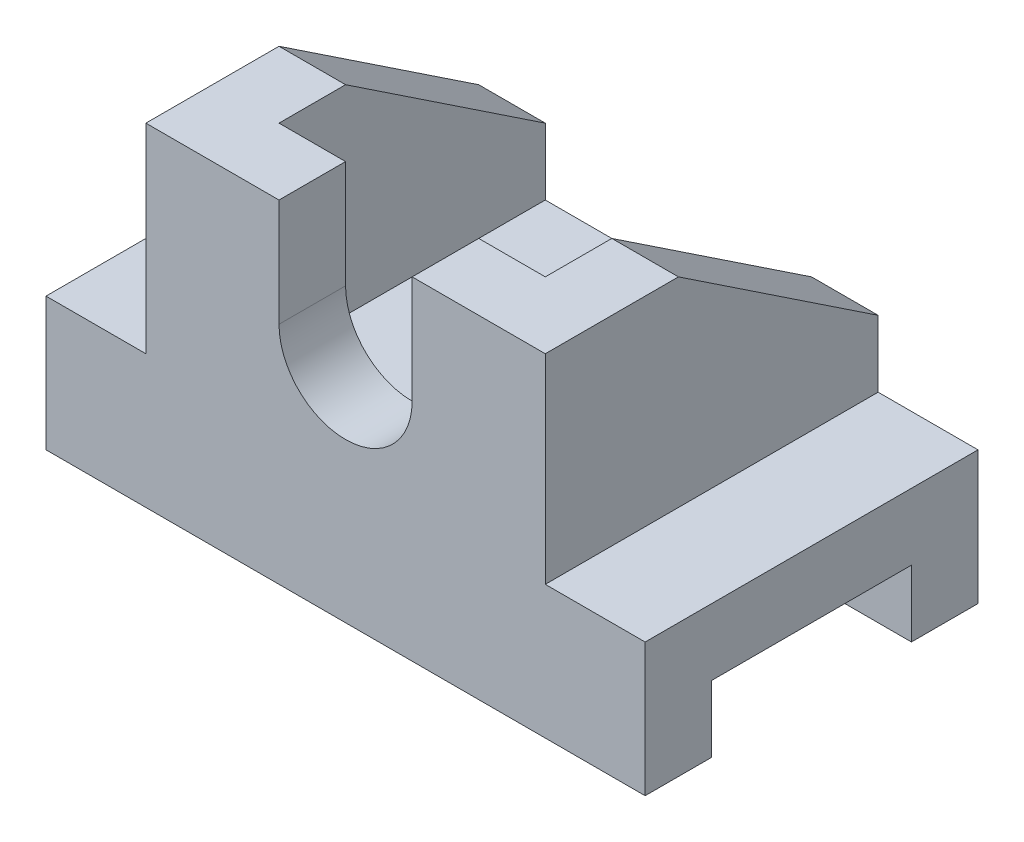
ISO-10303-21;
HEADER;
FILE_DESCRIPTION(('STEP AP214'),'2;1');
FILE_NAME('part.step','',(''),(''),'','','');
FILE_SCHEMA(('AUTOMOTIVE_DESIGN { 1 0 10303 214 1 1 1 1 }'));
ENDSEC;
DATA;
#1=APPLICATION_CONTEXT('core data for automotive mechanical design processes');
#2=APPLICATION_PROTOCOL_DEFINITION('international standard','automotive_design',2000,#1);
#3=PRODUCT_CONTEXT('',#1,'mechanical');
#4=PRODUCT('Part','Part','',(#3));
#5=PRODUCT_RELATED_PRODUCT_CATEGORY('part','',(#4));
#6=PRODUCT_DEFINITION_FORMATION('','',#4);
#7=PRODUCT_DEFINITION_CONTEXT('part definition',#1,'design');
#8=PRODUCT_DEFINITION('design','',#6,#7);
#9=PRODUCT_DEFINITION_SHAPE('','',#8);
#10=(LENGTH_UNIT() NAMED_UNIT(*) SI_UNIT(.MILLI.,.METRE.));
#11=(NAMED_UNIT(*) PLANE_ANGLE_UNIT() SI_UNIT($,.RADIAN.));
#12=(NAMED_UNIT(*) SI_UNIT($,.STERADIAN.) SOLID_ANGLE_UNIT());
#13=UNCERTAINTY_MEASURE_WITH_UNIT(LENGTH_MEASURE(1.E-05),#10,'distance_accuracy_value','');
#14=(GEOMETRIC_REPRESENTATION_CONTEXT(3) GLOBAL_UNCERTAINTY_ASSIGNED_CONTEXT((#13)) GLOBAL_UNIT_ASSIGNED_CONTEXT((#10,
#11,#12)) REPRESENTATION_CONTEXT('',''));
#15=CARTESIAN_POINT('',(0.,0.,0.));
#16=DIRECTION('',(0.,0.,1.));
#17=DIRECTION('',(1.,0.,0.));
#18=AXIS2_PLACEMENT_3D('',#15,#16,#17);
#19=CARTESIAN_POINT('',(45.,10.,-25.3409090909091));
#20=DIRECTION('',(0.,-1.,0.));
#21=DIRECTION('',(0.,0.,-1.));
#22=AXIS2_PLACEMENT_3D('',#19,#20,#21);
#23=PLANE('',#22);
#24=CARTESIAN_POINT('',(0.,10.,-5.34090909090908));
#25=DIRECTION('',(0.,1.,0.));
#26=DIRECTION('',(0.,0.,1.));
#27=AXIS2_PLACEMENT_3D('',#24,#25,#26);
#28=CIRCLE('',#27,10.);
#29=CARTESIAN_POINT('',(0.,10.,4.65909090909092));
#30=VERTEX_POINT('',#29);
#31=EDGE_CURVE('E257',#30,#30,#28,.T.);
#32=ORIENTED_EDGE('',*,*,#31,.F.);
#33=EDGE_LOOP('',(#32));
#34=FACE_BOUND('',#33,.T.);
#35=DIRECTION('',(0.,0.,-1.));
#36=VECTOR('',#35,1.);
#37=CARTESIAN_POINT('',(-20.,10.,14.6590909090909));
#38=LINE('',#37,#36);
#39=CARTESIAN_POINT('',(-20.,10.,14.6590909090909));
#40=VERTEX_POINT('',#39);
#41=CARTESIAN_POINT('',(-20.,10.,-25.3409090909091));
#42=VERTEX_POINT('',#41);
#43=EDGE_CURVE('E204',#40,#42,#38,.T.);
#44=ORIENTED_EDGE('',*,*,#43,.F.);
#45=DIRECTION('',(1.,0.,0.));
#46=VECTOR('',#45,1.);
#47=CARTESIAN_POINT('',(30.,10.,14.6590909090909));
#48=LINE('',#47,#46);
#49=CARTESIAN_POINT('',(20.,10.,14.6590909090909));
#50=VERTEX_POINT('',#49);
#51=EDGE_CURVE('E290',#40,#50,#48,.T.);
#52=ORIENTED_EDGE('',*,*,#51,.T.);
#53=DIRECTION('',(0.,0.,-1.));
#54=VECTOR('',#53,1.);
#55=CARTESIAN_POINT('',(20.,10.,14.6590909090909));
#56=LINE('',#55,#54);
#57=CARTESIAN_POINT('',(20.,10.,-25.3409090909091));
#58=VERTEX_POINT('',#57);
#59=EDGE_CURVE('E242',#50,#58,#56,.T.);
#60=ORIENTED_EDGE('',*,*,#59,.T.);
#61=DIRECTION('',(-1.,0.,0.));
#62=VECTOR('',#61,1.);
#63=CARTESIAN_POINT('',(45.,10.,-25.3409090909091));
#64=LINE('',#63,#62);
#65=EDGE_CURVE('E394',#58,#42,#64,.T.);
#66=ORIENTED_EDGE('',*,*,#65,.T.);
#67=EDGE_LOOP('',(#44,#52,#60,#66));
#68=FACE_BOUND('',#67,.T.);
#69=ADVANCED_FACE('F38',(#34,#68),#23,.F.);
#70=CARTESIAN_POINT('',(0.,0.,14.6590909090909));
#71=DIRECTION('',(0.,0.,-1.));
#72=DIRECTION('',(-1.,0.,0.));
#73=AXIS2_PLACEMENT_3D('',#70,#71,#72);
#74=PLANE('',#73);
#75=ORIENTED_EDGE('',*,*,#51,.F.);
#76=DIRECTION('',(0.,-1.,0.));
#77=VECTOR('',#76,1.);
#78=CARTESIAN_POINT('',(-20.,10.,14.6590909090909));
#79=LINE('',#78,#77);
#80=CARTESIAN_POINT('',(-20.,40.,14.6590909090909));
#81=VERTEX_POINT('',#80);
#82=EDGE_CURVE('E221',#81,#40,#79,.T.);
#83=ORIENTED_EDGE('',*,*,#82,.F.);
#84=DIRECTION('',(-1.,0.,0.));
#85=VECTOR('',#84,1.);
#86=CARTESIAN_POINT('',(-30.,40.,14.6590909090909));
#87=LINE('',#86,#85);
#88=CARTESIAN_POINT('',(-10.,40.,14.6590909090909));
#89=VERTEX_POINT('',#88);
#90=EDGE_CURVE('E293',#89,#81,#87,.T.);
#91=ORIENTED_EDGE('',*,*,#90,.F.);
#92=DIRECTION('',(0.,1.,0.));
#93=VECTOR('',#92,1.);
#94=CARTESIAN_POINT('',(-10.,0.,14.6590909090909));
#95=LINE('',#94,#93);
#96=CARTESIAN_POINT('',(-10.,23.83424034646,14.6590909090909));
#97=VERTEX_POINT('',#96);
#98=EDGE_CURVE('E411',#97,#89,#95,.T.);
#99=ORIENTED_EDGE('',*,*,#98,.F.);
#100=CARTESIAN_POINT('',(0.,23.83424034646,14.6590909090909));
#101=DIRECTION('',(0.,0.,-1.));
#102=DIRECTION('',(-1.,0.,0.));
#103=AXIS2_PLACEMENT_3D('',#100,#101,#102);
#104=CIRCLE('',#103,10.);
#105=CARTESIAN_POINT('',(10.,23.83424034646,14.6590909090909));
#106=VERTEX_POINT('',#105);
#107=EDGE_CURVE('E47',#106,#97,#104,.T.);
#108=ORIENTED_EDGE('',*,*,#107,.F.);
#109=DIRECTION('',(0.,-1.,0.));
#110=VECTOR('',#109,1.);
#111=CARTESIAN_POINT('',(10.,0.,14.6590909090909));
#112=LINE('',#111,#110);
#113=CARTESIAN_POINT('',(10.,40.,14.6590909090909));
#114=VERTEX_POINT('',#113);
#115=EDGE_CURVE('E11',#114,#106,#112,.T.);
#116=ORIENTED_EDGE('',*,*,#115,.F.);
#117=CARTESIAN_POINT('',(20.,40.,14.6590909090909));
#118=VERTEX_POINT('',#117);
#119=EDGE_CURVE('E295',#118,#114,#87,.T.);
#120=ORIENTED_EDGE('',*,*,#119,.F.);
#121=DIRECTION('',(0.,-1.,0.));
#122=VECTOR('',#121,1.);
#123=CARTESIAN_POINT('',(20.,10.,14.6590909090909));
#124=LINE('',#123,#122);
#125=EDGE_CURVE('E238',#118,#50,#124,.T.);
#126=ORIENTED_EDGE('',*,*,#125,.T.);
#127=EDGE_LOOP('',(#75,#83,#91,#99,#108,#116,#120,#126));
#128=FACE_BOUND('',#127,.T.);
#129=ADVANCED_FACE('F424',(#128),#74,.T.);
#130=DIRECTION('',(0.,0.,1.));
#131=VECTOR('',#130,1.);
#132=CARTESIAN_POINT('',(-30.,10.,14.6590909090909));
#133=LINE('',#132,#131);
#134=CARTESIAN_POINT('',(-30.,10.,-25.3409090909091));
#135=VERTEX_POINT('',#134);
#136=CARTESIAN_POINT('',(-30.,10.,24.6590909090909));
#137=VERTEX_POINT('',#136);
#138=EDGE_CURVE('E310',#135,#137,#133,.T.);
#139=ORIENTED_EDGE('',*,*,#138,.F.);
#140=CARTESIAN_POINT('',(-45.,10.,-25.3409090909091));
#141=VERTEX_POINT('',#140);
#142=EDGE_CURVE('E388',#135,#141,#64,.T.);
#143=ORIENTED_EDGE('',*,*,#142,.T.);
#144=DIRECTION('',(0.,0.,1.));
#145=VECTOR('',#144,1.);
#146=CARTESIAN_POINT('',(-45.,10.,-25.3409090909091));
#147=LINE('',#146,#145);
#148=CARTESIAN_POINT('',(-45.,9.99999999999999,24.6590909090909));
#149=VERTEX_POINT('',#148);
#150=EDGE_CURVE('E367',#141,#149,#147,.T.);
#151=ORIENTED_EDGE('',*,*,#150,.T.);
#152=DIRECTION('',(-1.,0.,0.));
#153=VECTOR('',#152,1.);
#154=CARTESIAN_POINT('',(45.,9.99999999999999,24.6590909090909));
#155=LINE('',#154,#153);
#156=EDGE_CURVE('E383',#137,#149,#155,.T.);
#157=ORIENTED_EDGE('',*,*,#156,.F.);
#158=EDGE_LOOP('',(#139,#143,#151,#157));
#159=FACE_BOUND('',#158,.T.);
#160=ADVANCED_FACE('F481',(#159),#23,.F.);
#161=CARTESIAN_POINT('',(-30.,40.,14.6590909090909));
#162=DIRECTION('',(0.,1.,0.));
#163=DIRECTION('',(0.,0.,1.));
#164=AXIS2_PLACEMENT_3D('',#161,#162,#163);
#165=PLANE('',#164);
#166=DIRECTION('',(0.,0.,1.));
#167=VECTOR('',#166,1.);
#168=CARTESIAN_POINT('',(20.,40.,4.65909090909092));
#169=LINE('',#168,#167);
#170=CARTESIAN_POINT('',(20.,40.,4.65909090909092));
#171=VERTEX_POINT('',#170);
#172=EDGE_CURVE('E234',#171,#118,#169,.T.);
#173=ORIENTED_EDGE('',*,*,#172,.T.);
#174=ORIENTED_EDGE('',*,*,#119,.T.);
#175=DIRECTION('',(0.,0.,1.));
#176=VECTOR('',#175,1.);
#177=CARTESIAN_POINT('',(10.,40.,-25.3409090909091));
#178=LINE('',#177,#176);
#179=CARTESIAN_POINT('',(10.,40.,24.6590909090909));
#180=VERTEX_POINT('',#179);
#181=EDGE_CURVE('E276',#114,#180,#178,.T.);
#182=ORIENTED_EDGE('',*,*,#181,.T.);
#183=DIRECTION('',(-1.,0.,0.));
#184=VECTOR('',#183,1.);
#185=CARTESIAN_POINT('',(-30.,40.,24.6590909090909));
#186=LINE('',#185,#184);
#187=CARTESIAN_POINT('',(30.,40.,24.6590909090909));
#188=VERTEX_POINT('',#187);
#189=EDGE_CURVE('E303',#188,#180,#186,.T.);
#190=ORIENTED_EDGE('',*,*,#189,.F.);
#191=DIRECTION('',(0.,0.,1.));
#192=VECTOR('',#191,1.);
#193=CARTESIAN_POINT('',(30.,40.,14.6590909090909));
#194=LINE('',#193,#192);
#195=CARTESIAN_POINT('',(30.,40.,4.65909090909092));
#196=VERTEX_POINT('',#195);
#197=EDGE_CURVE('E318',#196,#188,#194,.T.);
#198=ORIENTED_EDGE('',*,*,#197,.F.);
#199=DIRECTION('',(1.,0.,0.));
#200=VECTOR('',#199,1.);
#201=CARTESIAN_POINT('',(20.,40.,4.65909090909092));
#202=LINE('',#201,#200);
#203=EDGE_CURVE('E253',#171,#196,#202,.T.);
#204=ORIENTED_EDGE('',*,*,#203,.F.);
#205=EDGE_LOOP('',(#173,#174,#182,#190,#198,#204));
#206=FACE_BOUND('',#205,.T.);
#207=ADVANCED_FACE('F499',(#206),#165,.T.);
#208=CARTESIAN_POINT('',(45.,10.,-25.3409090909091));
#209=VERTEX_POINT('',#208);
#210=CARTESIAN_POINT('',(30.,10.,-25.3409090909091));
#211=VERTEX_POINT('',#210);
#212=EDGE_CURVE('E389',#209,#211,#64,.T.);
#213=ORIENTED_EDGE('',*,*,#212,.T.);
#214=DIRECTION('',(0.,0.,1.));
#215=VECTOR('',#214,1.);
#216=CARTESIAN_POINT('',(30.,10.,14.6590909090909));
#217=LINE('',#216,#215);
#218=CARTESIAN_POINT('',(30.,9.99999999999999,24.6590909090909));
#219=VERTEX_POINT('',#218);
#220=EDGE_CURVE('E298',#211,#219,#217,.T.);
#221=ORIENTED_EDGE('',*,*,#220,.T.);
#222=CARTESIAN_POINT('',(45.,9.99999999999999,24.6590909090909));
#223=VERTEX_POINT('',#222);
#224=EDGE_CURVE('E384',#223,#219,#155,.T.);
#225=ORIENTED_EDGE('',*,*,#224,.F.);
#226=DIRECTION('',(0.,0.,1.));
#227=VECTOR('',#226,1.);
#228=CARTESIAN_POINT('',(45.,10.,-25.3409090909091));
#229=LINE('',#228,#227);
#230=EDGE_CURVE('E340',#209,#223,#229,.T.);
#231=ORIENTED_EDGE('',*,*,#230,.F.);
#232=EDGE_LOOP('',(#213,#221,#225,#231));
#233=FACE_BOUND('',#232,.T.);
#234=ADVANCED_FACE('F509',(#233),#23,.F.);
#235=CARTESIAN_POINT('',(45.,-10.,14.6590909090909));
#236=DIRECTION('',(0.,0.,1.));
#237=DIRECTION('',(1.,0.,0.));
#238=AXIS2_PLACEMENT_3D('',#235,#236,#237);
#239=PLANE('',#238);
#240=DIRECTION('',(0.,1.,0.));
#241=VECTOR('',#240,1.);
#242=CARTESIAN_POINT('',(-45.,-10.,14.6590909090909));
#243=LINE('',#242,#241);
#244=CARTESIAN_POINT('',(-45.,-10.,14.6590909090909));
#245=VERTEX_POINT('',#244);
#246=CARTESIAN_POINT('',(-45.,0.,14.6590909090909));
#247=VERTEX_POINT('',#246);
#248=EDGE_CURVE('E313',#245,#247,#243,.T.);
#249=ORIENTED_EDGE('',*,*,#248,.T.);
#250=DIRECTION('',(-1.,0.,0.));
#251=VECTOR('',#250,1.);
#252=CARTESIAN_POINT('',(45.,0.,14.6590909090909));
#253=LINE('',#252,#251);
#254=CARTESIAN_POINT('',(45.,0.,14.6590909090909));
#255=VERTEX_POINT('',#254);
#256=EDGE_CURVE('E407',#255,#247,#253,.T.);
#257=ORIENTED_EDGE('',*,*,#256,.F.);
#258=DIRECTION('',(0.,1.,0.));
#259=VECTOR('',#258,1.);
#260=CARTESIAN_POINT('',(45.,-10.,14.6590909090909));
#261=LINE('',#260,#259);
#262=CARTESIAN_POINT('',(45.,-10.,14.6590909090909));
#263=VERTEX_POINT('',#262);
#264=EDGE_CURVE('E323',#263,#255,#261,.T.);
#265=ORIENTED_EDGE('',*,*,#264,.F.);
#266=DIRECTION('',(-1.,0.,0.));
#267=VECTOR('',#266,1.);
#268=CARTESIAN_POINT('',(45.,-10.,14.6590909090909));
#269=LINE('',#268,#267);
#270=EDGE_CURVE('E349',#263,#245,#269,.T.);
#271=ORIENTED_EDGE('',*,*,#270,.T.);
#272=EDGE_LOOP('',(#249,#257,#265,#271));
#273=FACE_BOUND('',#272,.T.);
#274=ADVANCED_FACE('F40',(#273),#239,.F.);
#275=CARTESIAN_POINT('',(45.,0.,14.6590909090909));
#276=DIRECTION('',(0.,1.,0.));
#277=DIRECTION('',(0.,0.,1.));
#278=AXIS2_PLACEMENT_3D('',#275,#276,#277);
#279=PLANE('',#278);
#280=DIRECTION('',(-1.,0.,0.));
#281=VECTOR('',#280,1.);
#282=CARTESIAN_POINT('',(45.,0.,-15.3409090909091));
#283=LINE('',#282,#281);
#284=CARTESIAN_POINT('',(0.,0.,-15.3409090909091));
#285=VERTEX_POINT('',#284);
#286=CARTESIAN_POINT('',(-45.,0.,-15.3409090909091));
#287=VERTEX_POINT('',#286);
#288=EDGE_CURVE('E402',#285,#287,#283,.T.);
#289=ORIENTED_EDGE('',*,*,#288,.F.);
#290=CARTESIAN_POINT('',(0.,0.,-5.34090909090908));
#291=DIRECTION('',(0.,1.,0.));
#292=DIRECTION('',(0.,0.,1.));
#293=AXIS2_PLACEMENT_3D('',#290,#291,#292);
#294=CIRCLE('',#293,10.);
#295=EDGE_CURVE('E60',#285,#285,#294,.T.);
#296=ORIENTED_EDGE('',*,*,#295,.T.);
#297=CARTESIAN_POINT('',(45.,0.,-15.3409090909091));
#298=VERTEX_POINT('',#297);
#299=EDGE_CURVE('E403',#298,#285,#283,.T.);
#300=ORIENTED_EDGE('',*,*,#299,.F.);
#301=DIRECTION('',(0.,0.,-1.));
#302=VECTOR('',#301,1.);
#303=CARTESIAN_POINT('',(45.,0.,14.6590909090909));
#304=LINE('',#303,#302);
#305=EDGE_CURVE('E327',#255,#298,#304,.T.);
#306=ORIENTED_EDGE('',*,*,#305,.F.);
#307=ORIENTED_EDGE('',*,*,#256,.T.);
#308=DIRECTION('',(0.,0.,-1.));
#309=VECTOR('',#308,1.);
#310=CARTESIAN_POINT('',(-45.,0.,14.6590909090909));
#311=LINE('',#310,#309);
#312=EDGE_CURVE('E353',#247,#287,#311,.T.);
#313=ORIENTED_EDGE('',*,*,#312,.T.);
#314=EDGE_LOOP('',(#289,#296,#300,#306,#307,#313));
#315=FACE_BOUND('',#314,.T.);
#316=ADVANCED_FACE('F449',(#315),#279,.F.);
#317=CARTESIAN_POINT('',(45.,0.,-15.3409090909091));
#318=DIRECTION('',(0.,0.,-1.));
#319=DIRECTION('',(0.,1.,0.));
#320=AXIS2_PLACEMENT_3D('',#317,#318,#319);
#321=PLANE('',#320);
#322=DIRECTION('',(0.,-1.,0.));
#323=VECTOR('',#322,1.);
#324=CARTESIAN_POINT('',(-45.,0.,-15.3409090909091));
#325=LINE('',#324,#323);
#326=CARTESIAN_POINT('',(-45.,-10.,-15.3409090909091));
#327=VERTEX_POINT('',#326);
#328=EDGE_CURVE('E357',#287,#327,#325,.T.);
#329=ORIENTED_EDGE('',*,*,#328,.T.);
#330=DIRECTION('',(-1.,0.,0.));
#331=VECTOR('',#330,1.);
#332=CARTESIAN_POINT('',(45.,-10.,-15.3409090909091));
#333=LINE('',#332,#331);
#334=CARTESIAN_POINT('',(45.,-10.,-15.3409090909091));
#335=VERTEX_POINT('',#334);
#336=EDGE_CURVE('E398',#335,#327,#333,.T.);
#337=ORIENTED_EDGE('',*,*,#336,.F.);
#338=DIRECTION('',(0.,-1.,0.));
#339=VECTOR('',#338,1.);
#340=CARTESIAN_POINT('',(45.,0.,-15.3409090909091));
#341=LINE('',#340,#339);
#342=EDGE_CURVE('E331',#298,#335,#341,.T.);
#343=ORIENTED_EDGE('',*,*,#342,.F.);
#344=ORIENTED_EDGE('',*,*,#299,.T.);
#345=ORIENTED_EDGE('',*,*,#288,.T.);
#346=EDGE_LOOP('',(#329,#337,#343,#344,#345));
#347=FACE_BOUND('',#346,.T.);
#348=ADVANCED_FACE('F443',(#347),#321,.F.);
#349=CARTESIAN_POINT('',(45.,-10.,-15.3409090909091));
#350=DIRECTION('',(0.,1.,0.));
#351=DIRECTION('',(0.,0.,1.));
#352=AXIS2_PLACEMENT_3D('',#349,#350,#351);
#353=PLANE('',#352);
#354=DIRECTION('',(0.,0.,-1.));
#355=VECTOR('',#354,1.);
#356=CARTESIAN_POINT('',(-45.,-10.,-15.3409090909091));
#357=LINE('',#356,#355);
#358=CARTESIAN_POINT('',(-45.,-10.,-25.3409090909091));
#359=VERTEX_POINT('',#358);
#360=EDGE_CURVE('E360',#327,#359,#357,.T.);
#361=ORIENTED_EDGE('',*,*,#360,.T.);
#362=DIRECTION('',(-1.,0.,0.));
#363=VECTOR('',#362,1.);
#364=CARTESIAN_POINT('',(45.,-10.,-25.3409090909091));
#365=LINE('',#364,#363);
#366=CARTESIAN_POINT('',(45.,-10.,-25.3409090909091));
#367=VERTEX_POINT('',#366);
#368=EDGE_CURVE('E393',#367,#359,#365,.T.);
#369=ORIENTED_EDGE('',*,*,#368,.F.);
#370=DIRECTION('',(0.,0.,-1.));
#371=VECTOR('',#370,1.);
#372=CARTESIAN_POINT('',(45.,-10.,-15.3409090909091));
#373=LINE('',#372,#371);
#374=EDGE_CURVE('E334',#335,#367,#373,.T.);
#375=ORIENTED_EDGE('',*,*,#374,.F.);
#376=ORIENTED_EDGE('',*,*,#336,.T.);
#377=EDGE_LOOP('',(#361,#369,#375,#376));
#378=FACE_BOUND('',#377,.T.);
#379=ADVANCED_FACE('F459',(#378),#353,.F.);
#380=CARTESIAN_POINT('',(45.,-10.,-25.3409090909091));
#381=DIRECTION('',(0.,0.,1.));
#382=DIRECTION('',(1.,0.,0.));
#383=AXIS2_PLACEMENT_3D('',#380,#381,#382);
#384=PLANE('',#383);
#385=ORIENTED_EDGE('',*,*,#65,.F.);
#386=DIRECTION('',(0.,1.,0.));
#387=VECTOR('',#386,1.);
#388=CARTESIAN_POINT('',(20.,10.,-25.3409090909091));
#389=LINE('',#388,#387);
#390=CARTESIAN_POINT('',(20.,20.,-25.3409090909091));
#391=VERTEX_POINT('',#390);
#392=EDGE_CURVE('E225',#58,#391,#389,.T.);
#393=ORIENTED_EDGE('',*,*,#392,.T.);
#394=DIRECTION('',(1.,0.,0.));
#395=VECTOR('',#394,1.);
#396=CARTESIAN_POINT('',(20.,20.,-25.3409090909091));
#397=LINE('',#396,#395);
#398=CARTESIAN_POINT('',(30.,20.,-25.3409090909091));
#399=VERTEX_POINT('',#398);
#400=EDGE_CURVE('E246',#391,#399,#397,.T.);
#401=ORIENTED_EDGE('',*,*,#400,.T.);
#402=DIRECTION('',(0.,1.,0.));
#403=VECTOR('',#402,1.);
#404=CARTESIAN_POINT('',(30.,10.,-25.3409090909091));
#405=LINE('',#404,#403);
#406=EDGE_CURVE('E219',#211,#399,#405,.T.);
#407=ORIENTED_EDGE('',*,*,#406,.F.);
#408=ORIENTED_EDGE('',*,*,#212,.F.);
#409=DIRECTION('',(0.,1.,0.));
#410=VECTOR('',#409,1.);
#411=CARTESIAN_POINT('',(45.,-10.,-25.3409090909091));
#412=LINE('',#411,#410);
#413=EDGE_CURVE('E337',#367,#209,#412,.T.);
#414=ORIENTED_EDGE('',*,*,#413,.F.);
#415=ORIENTED_EDGE('',*,*,#368,.T.);
#416=DIRECTION('',(0.,1.,0.));
#417=VECTOR('',#416,1.);
#418=CARTESIAN_POINT('',(-45.,-10.,-25.3409090909091));
#419=LINE('',#418,#417);
#420=EDGE_CURVE('E363',#359,#141,#419,.T.);
#421=ORIENTED_EDGE('',*,*,#420,.T.);
#422=ORIENTED_EDGE('',*,*,#142,.F.);
#423=DIRECTION('',(0.,1.,0.));
#424=VECTOR('',#423,1.);
#425=CARTESIAN_POINT('',(-30.,10.,-25.3409090909091));
#426=LINE('',#425,#424);
#427=CARTESIAN_POINT('',(-30.,20.,-25.3409090909091));
#428=VERTEX_POINT('',#427);
#429=EDGE_CURVE('E214',#135,#428,#426,.T.);
#430=ORIENTED_EDGE('',*,*,#429,.T.);
#431=DIRECTION('',(-1.,0.,0.));
#432=VECTOR('',#431,1.);
#433=CARTESIAN_POINT('',(-20.,20.,-25.3409090909091));
#434=LINE('',#433,#432);
#435=CARTESIAN_POINT('',(-20.,20.,-25.3409090909091));
#436=VERTEX_POINT('',#435);
#437=EDGE_CURVE('E194',#436,#428,#434,.T.);
#438=ORIENTED_EDGE('',*,*,#437,.F.);
#439=DIRECTION('',(0.,1.,0.));
#440=VECTOR('',#439,1.);
#441=CARTESIAN_POINT('',(-20.,10.,-25.3409090909091));
#442=LINE('',#441,#440);
#443=EDGE_CURVE('E199',#42,#436,#442,.T.);
#444=ORIENTED_EDGE('',*,*,#443,.F.);
#445=EDGE_LOOP('',(#385,#393,#401,#407,#408,#414,#415,#421,#422,#430,#438,#444));
#446=FACE_BOUND('',#445,.T.);
#447=ADVANCED_FACE('F211',(#446),#384,.F.);
#448=CARTESIAN_POINT('',(45.,9.99999999999999,24.6590909090909));
#449=DIRECTION('',(0.,0.,-1.));
#450=DIRECTION('',(-1.,0.,0.));
#451=AXIS2_PLACEMENT_3D('',#448,#449,#450);
#452=PLANE('',#451);
#453=ORIENTED_EDGE('',*,*,#189,.T.);
#454=DIRECTION('',(0.,1.,0.));
#455=VECTOR('',#454,1.);
#456=CARTESIAN_POINT('',(10.,40.,24.6590909090909));
#457=LINE('',#456,#455);
#458=CARTESIAN_POINT('',(10.,23.83424034646,24.6590909090909));
#459=VERTEX_POINT('',#458);
#460=EDGE_CURVE('E262',#459,#180,#457,.T.);
#461=ORIENTED_EDGE('',*,*,#460,.F.);
#462=CARTESIAN_POINT('',(0.,23.83424034646,24.6590909090909));
#463=DIRECTION('',(0.,0.,1.));
#464=DIRECTION('',(1.,0.,0.));
#465=AXIS2_PLACEMENT_3D('',#462,#463,#464);
#466=CIRCLE('',#465,10.);
#467=CARTESIAN_POINT('',(-10.,23.83424034646,24.6590909090909));
#468=VERTEX_POINT('',#467);
#469=EDGE_CURVE('E272',#468,#459,#466,.T.);
#470=ORIENTED_EDGE('',*,*,#469,.F.);
#471=DIRECTION('',(0.,-1.,0.));
#472=VECTOR('',#471,1.);
#473=CARTESIAN_POINT('',(-10.,23.83424034646,24.6590909090909));
#474=LINE('',#473,#472);
#475=CARTESIAN_POINT('',(-10.,40.,24.6590909090909));
#476=VERTEX_POINT('',#475);
#477=EDGE_CURVE('E268',#476,#468,#474,.T.);
#478=ORIENTED_EDGE('',*,*,#477,.F.);
#479=CARTESIAN_POINT('',(-30.,40.,24.6590909090909));
#480=VERTEX_POINT('',#479);
#481=EDGE_CURVE('E302',#476,#480,#186,.T.);
#482=ORIENTED_EDGE('',*,*,#481,.T.);
#483=DIRECTION('',(0.,-1.,0.));
#484=VECTOR('',#483,1.);
#485=CARTESIAN_POINT('',(-30.,10.,24.6590909090909));
#486=LINE('',#485,#484);
#487=EDGE_CURVE('E294',#480,#137,#486,.T.);
#488=ORIENTED_EDGE('',*,*,#487,.T.);
#489=ORIENTED_EDGE('',*,*,#156,.T.);
#490=DIRECTION('',(0.,-1.,0.));
#491=VECTOR('',#490,1.);
#492=CARTESIAN_POINT('',(-45.,9.99999999999999,24.6590909090909));
#493=LINE('',#492,#491);
#494=CARTESIAN_POINT('',(-45.,-10.,24.6590909090909));
#495=VERTEX_POINT('',#494);
#496=EDGE_CURVE('E371',#149,#495,#493,.T.);
#497=ORIENTED_EDGE('',*,*,#496,.T.);
#498=DIRECTION('',(-1.,0.,0.));
#499=VECTOR('',#498,1.);
#500=CARTESIAN_POINT('',(45.,-10.,24.6590909090909));
#501=LINE('',#500,#499);
#502=CARTESIAN_POINT('',(45.,-10.,24.6590909090909));
#503=VERTEX_POINT('',#502);
#504=EDGE_CURVE('E379',#503,#495,#501,.T.);
#505=ORIENTED_EDGE('',*,*,#504,.F.);
#506=DIRECTION('',(0.,-1.,0.));
#507=VECTOR('',#506,1.);
#508=CARTESIAN_POINT('',(45.,9.99999999999999,24.6590909090909));
#509=LINE('',#508,#507);
#510=EDGE_CURVE('E343',#223,#503,#509,.T.);
#511=ORIENTED_EDGE('',*,*,#510,.F.);
#512=ORIENTED_EDGE('',*,*,#224,.T.);
#513=DIRECTION('',(0.,1.,0.));
#514=VECTOR('',#513,1.);
#515=CARTESIAN_POINT('',(30.,40.,24.6590909090909));
#516=LINE('',#515,#514);
#517=EDGE_CURVE('E280',#219,#188,#516,.T.);
#518=ORIENTED_EDGE('',*,*,#517,.T.);
#519=EDGE_LOOP('',(#453,#461,#470,#478,#482,#488,#489,#497,#505,#511,#512,#518));
#520=FACE_BOUND('',#519,.T.);
#521=ADVANCED_FACE('F478',(#520),#452,.F.);
#522=CARTESIAN_POINT('',(45.,-10.,24.6590909090909));
#523=DIRECTION('',(0.,1.,0.));
#524=DIRECTION('',(0.,0.,1.));
#525=AXIS2_PLACEMENT_3D('',#522,#523,#524);
#526=PLANE('',#525);
#527=DIRECTION('',(0.,0.,-1.));
#528=VECTOR('',#527,1.);
#529=CARTESIAN_POINT('',(-45.,-10.,24.6590909090909));
#530=LINE('',#529,#528);
#531=EDGE_CURVE('E328',#495,#245,#530,.T.);
#532=ORIENTED_EDGE('',*,*,#531,.T.);
#533=ORIENTED_EDGE('',*,*,#270,.F.);
#534=DIRECTION('',(0.,0.,-1.));
#535=VECTOR('',#534,1.);
#536=CARTESIAN_POINT('',(45.,-10.,24.6590909090909));
#537=LINE('',#536,#535);
#538=EDGE_CURVE('E346',#503,#263,#537,.T.);
#539=ORIENTED_EDGE('',*,*,#538,.F.);
#540=ORIENTED_EDGE('',*,*,#504,.T.);
#541=EDGE_LOOP('',(#532,#533,#539,#540));
#542=FACE_BOUND('',#541,.T.);
#543=ADVANCED_FACE('F475',(#542),#526,.F.);
#544=CARTESIAN_POINT('',(45.,0.,0.));
#545=DIRECTION('',(-1.,0.,0.));
#546=DIRECTION('',(0.,0.,1.));
#547=AXIS2_PLACEMENT_3D('',#544,#545,#546);
#548=PLANE('',#547);
#549=ORIENTED_EDGE('',*,*,#264,.T.);
#550=ORIENTED_EDGE('',*,*,#305,.T.);
#551=ORIENTED_EDGE('',*,*,#342,.T.);
#552=ORIENTED_EDGE('',*,*,#374,.T.);
#553=ORIENTED_EDGE('',*,*,#413,.T.);
#554=ORIENTED_EDGE('',*,*,#230,.T.);
#555=ORIENTED_EDGE('',*,*,#510,.T.);
#556=ORIENTED_EDGE('',*,*,#538,.T.);
#557=EDGE_LOOP('',(#549,#550,#551,#552,#553,#554,#555,#556));
#558=FACE_BOUND('',#557,.T.);
#559=ADVANCED_FACE('F466',(#558),#548,.F.);
#560=CARTESIAN_POINT('',(-45.,0.,0.));
#561=DIRECTION('',(-1.,0.,0.));
#562=DIRECTION('',(0.,0.,1.));
#563=AXIS2_PLACEMENT_3D('',#560,#561,#562);
#564=PLANE('',#563);
#565=ORIENTED_EDGE('',*,*,#248,.F.);
#566=ORIENTED_EDGE('',*,*,#531,.F.);
#567=ORIENTED_EDGE('',*,*,#496,.F.);
#568=ORIENTED_EDGE('',*,*,#150,.F.);
#569=ORIENTED_EDGE('',*,*,#420,.F.);
#570=ORIENTED_EDGE('',*,*,#360,.F.);
#571=ORIENTED_EDGE('',*,*,#328,.F.);
#572=ORIENTED_EDGE('',*,*,#312,.F.);
#573=EDGE_LOOP('',(#565,#566,#567,#568,#569,#570,#571,#572));
#574=FACE_BOUND('',#573,.T.);
#575=ADVANCED_FACE('F454',(#574),#564,.T.);
#576=CARTESIAN_POINT('',(-30.,10.,14.6590909090909));
#577=DIRECTION('',(-1.,0.,0.));
#578=DIRECTION('',(0.,0.,1.));
#579=AXIS2_PLACEMENT_3D('',#576,#577,#578);
#580=PLANE('',#579);
#581=ORIENTED_EDGE('',*,*,#487,.F.);
#582=DIRECTION('',(0.,0.,1.));
#583=VECTOR('',#582,1.);
#584=CARTESIAN_POINT('',(-30.,40.,14.6590909090909));
#585=LINE('',#584,#583);
#586=CARTESIAN_POINT('',(-30.,40.,4.65909090909092));
#587=VERTEX_POINT('',#586);
#588=EDGE_CURVE('E314',#587,#480,#585,.T.);
#589=ORIENTED_EDGE('',*,*,#588,.F.);
#590=DIRECTION('',(0.,0.554700196225229,0.832050294337844));
#591=VECTOR('',#590,1.);
#592=CARTESIAN_POINT('',(-30.,20.,-25.3409090909091));
#593=LINE('',#592,#591);
#594=EDGE_CURVE('E209',#428,#587,#593,.T.);
#595=ORIENTED_EDGE('',*,*,#594,.F.);
#596=ORIENTED_EDGE('',*,*,#429,.F.);
#597=ORIENTED_EDGE('',*,*,#138,.T.);
#598=EDGE_LOOP('',(#581,#589,#595,#596,#597));
#599=FACE_BOUND('',#598,.T.);
#600=ADVANCED_FACE('F483',(#599),#580,.T.);
#601=DIRECTION('',(0.,0.,1.));
#602=VECTOR('',#601,1.);
#603=CARTESIAN_POINT('',(-10.,40.,-25.3409090909091));
#604=LINE('',#603,#602);
#605=EDGE_CURVE('E284',#89,#476,#604,.T.);
#606=ORIENTED_EDGE('',*,*,#605,.F.);
#607=ORIENTED_EDGE('',*,*,#90,.T.);
#608=DIRECTION('',(0.,0.,1.));
#609=VECTOR('',#608,1.);
#610=CARTESIAN_POINT('',(-20.,40.,4.65909090909092));
#611=LINE('',#610,#609);
#612=CARTESIAN_POINT('',(-20.,40.,4.65909090909092));
#613=VERTEX_POINT('',#612);
#614=EDGE_CURVE('E54',#613,#81,#611,.T.);
#615=ORIENTED_EDGE('',*,*,#614,.F.);
#616=DIRECTION('',(-1.,0.,0.));
#617=VECTOR('',#616,1.);
#618=CARTESIAN_POINT('',(-20.,40.,4.65909090909092));
#619=LINE('',#618,#617);
#620=EDGE_CURVE('E197',#613,#587,#619,.T.);
#621=ORIENTED_EDGE('',*,*,#620,.T.);
#622=ORIENTED_EDGE('',*,*,#588,.T.);
#623=ORIENTED_EDGE('',*,*,#481,.F.);
#624=EDGE_LOOP('',(#606,#607,#615,#621,#622,#623));
#625=FACE_BOUND('',#624,.T.);
#626=ADVANCED_FACE('F432',(#625),#165,.T.);
#627=CARTESIAN_POINT('',(30.,40.,14.6590909090909));
#628=DIRECTION('',(1.,0.,0.));
#629=DIRECTION('',(0.,0.,-1.));
#630=AXIS2_PLACEMENT_3D('',#627,#628,#629);
#631=PLANE('',#630);
#632=ORIENTED_EDGE('',*,*,#197,.T.);
#633=ORIENTED_EDGE('',*,*,#517,.F.);
#634=ORIENTED_EDGE('',*,*,#220,.F.);
#635=ORIENTED_EDGE('',*,*,#406,.T.);
#636=DIRECTION('',(0.,0.554700196225229,0.832050294337844));
#637=VECTOR('',#636,1.);
#638=CARTESIAN_POINT('',(30.,20.,-25.3409090909091));
#639=LINE('',#638,#637);
#640=EDGE_CURVE('E230',#399,#196,#639,.T.);
#641=ORIENTED_EDGE('',*,*,#640,.T.);
#642=EDGE_LOOP('',(#632,#633,#634,#635,#641));
#643=FACE_BOUND('',#642,.T.);
#644=ADVANCED_FACE('F506',(#643),#631,.T.);
#645=CARTESIAN_POINT('',(10.,40.,-25.3409090909091));
#646=DIRECTION('',(1.,0.,0.));
#647=DIRECTION('',(0.,0.,-1.));
#648=AXIS2_PLACEMENT_3D('',#645,#646,#647);
#649=PLANE('',#648);
#650=ORIENTED_EDGE('',*,*,#115,.T.);
#651=DIRECTION('',(0.,0.,1.));
#652=VECTOR('',#651,1.);
#653=CARTESIAN_POINT('',(10.,23.83424034646,-25.3409090909091));
#654=LINE('',#653,#652);
#655=EDGE_CURVE('E277',#106,#459,#654,.T.);
#656=ORIENTED_EDGE('',*,*,#655,.T.);
#657=ORIENTED_EDGE('',*,*,#460,.T.);
#658=ORIENTED_EDGE('',*,*,#181,.F.);
#659=EDGE_LOOP('',(#650,#656,#657,#658));
#660=FACE_BOUND('',#659,.T.);
#661=ADVANCED_FACE('F513',(#660),#649,.F.);
#662=CARTESIAN_POINT('',(0.,23.83424034646,-25.3409090909091));
#663=DIRECTION('',(0.,0.,1.));
#664=DIRECTION('',(1.,0.,0.));
#665=AXIS2_PLACEMENT_3D('',#662,#663,#664);
#666=CYLINDRICAL_SURFACE('',#665,10.);
#667=ORIENTED_EDGE('',*,*,#107,.T.);
#668=DIRECTION('',(0.,0.,1.));
#669=VECTOR('',#668,1.);
#670=CARTESIAN_POINT('',(-10.,23.83424034646,-25.3409090909091));
#671=LINE('',#670,#669);
#672=EDGE_CURVE('E281',#97,#468,#671,.T.);
#673=ORIENTED_EDGE('',*,*,#672,.T.);
#674=ORIENTED_EDGE('',*,*,#469,.T.);
#675=ORIENTED_EDGE('',*,*,#655,.F.);
#676=EDGE_LOOP('',(#667,#673,#674,#675));
#677=FACE_BOUND('',#676,.T.);
#678=ADVANCED_FACE('F419',(#677),#666,.F.);
#679=CARTESIAN_POINT('',(-10.,23.83424034646,-25.3409090909091));
#680=DIRECTION('',(-1.,0.,0.));
#681=DIRECTION('',(0.,0.,1.));
#682=AXIS2_PLACEMENT_3D('',#679,#680,#681);
#683=PLANE('',#682);
#684=ORIENTED_EDGE('',*,*,#98,.T.);
#685=ORIENTED_EDGE('',*,*,#605,.T.);
#686=ORIENTED_EDGE('',*,*,#477,.T.);
#687=ORIENTED_EDGE('',*,*,#672,.F.);
#688=EDGE_LOOP('',(#684,#685,#686,#687));
#689=FACE_BOUND('',#688,.T.);
#690=ADVANCED_FACE('F428',(#689),#683,.F.);
#691=CARTESIAN_POINT('',(0.,0.,-5.34090909090908));
#692=DIRECTION('',(0.,1.,0.));
#693=DIRECTION('',(0.,0.,1.));
#694=AXIS2_PLACEMENT_3D('',#691,#692,#693);
#695=CYLINDRICAL_SURFACE('',#694,10.);
#696=ORIENTED_EDGE('',*,*,#295,.F.);
#697=EDGE_LOOP('',(#696));
#698=FACE_BOUND('',#697,.T.);
#699=ORIENTED_EDGE('',*,*,#31,.T.);
#700=EDGE_LOOP('',(#699));
#701=FACE_BOUND('',#700,.T.);
#702=ADVANCED_FACE('F623',(#698,#701),#695,.F.);
#703=CARTESIAN_POINT('',(20.,20.,-25.3409090909091));
#704=DIRECTION('',(0.,0.832050294337844,-0.554700196225229));
#705=DIRECTION('',(0.,0.554700196225229,0.832050294337844));
#706=AXIS2_PLACEMENT_3D('',#703,#704,#705);
#707=PLANE('',#706);
#708=ORIENTED_EDGE('',*,*,#640,.F.);
#709=ORIENTED_EDGE('',*,*,#400,.F.);
#710=DIRECTION('',(0.,0.554700196225229,0.832050294337844));
#711=VECTOR('',#710,1.);
#712=CARTESIAN_POINT('',(20.,20.,-25.3409090909091));
#713=LINE('',#712,#711);
#714=EDGE_CURVE('E229',#391,#171,#713,.T.);
#715=ORIENTED_EDGE('',*,*,#714,.T.);
#716=ORIENTED_EDGE('',*,*,#203,.T.);
#717=EDGE_LOOP('',(#708,#709,#715,#716));
#718=FACE_BOUND('',#717,.T.);
#719=ADVANCED_FACE('F504',(#718),#707,.T.);
#720=CARTESIAN_POINT('',(20.,0.,0.));
#721=DIRECTION('',(1.,0.,0.));
#722=DIRECTION('',(0.,0.,-1.));
#723=AXIS2_PLACEMENT_3D('',#720,#721,#722);
#724=PLANE('',#723);
#725=ORIENTED_EDGE('',*,*,#392,.F.);
#726=ORIENTED_EDGE('',*,*,#59,.F.);
#727=ORIENTED_EDGE('',*,*,#125,.F.);
#728=ORIENTED_EDGE('',*,*,#172,.F.);
#729=ORIENTED_EDGE('',*,*,#714,.F.);
#730=EDGE_LOOP('',(#725,#726,#727,#728,#729));
#731=FACE_BOUND('',#730,.T.);
#732=ADVANCED_FACE('F496',(#731),#724,.F.);
#733=CARTESIAN_POINT('',(-20.,20.,-25.3409090909091));
#734=DIRECTION('',(0.,0.832050294337844,-0.554700196225229));
#735=DIRECTION('',(0.,0.554700196225229,0.832050294337844));
#736=AXIS2_PLACEMENT_3D('',#733,#734,#735);
#737=PLANE('',#736);
#738=ORIENTED_EDGE('',*,*,#594,.T.);
#739=ORIENTED_EDGE('',*,*,#620,.F.);
#740=DIRECTION('',(0.,0.554700196225229,0.832050294337844));
#741=VECTOR('',#740,1.);
#742=CARTESIAN_POINT('',(-20.,20.,-25.3409090909091));
#743=LINE('',#742,#741);
#744=EDGE_CURVE('E189',#436,#613,#743,.T.);
#745=ORIENTED_EDGE('',*,*,#744,.F.);
#746=ORIENTED_EDGE('',*,*,#437,.T.);
#747=EDGE_LOOP('',(#738,#739,#745,#746));
#748=FACE_BOUND('',#747,.T.);
#749=ADVANCED_FACE('F192',(#748),#737,.T.);
#750=CARTESIAN_POINT('',(-20.,0.,0.));
#751=DIRECTION('',(-1.,0.,0.));
#752=DIRECTION('',(0.,0.,-1.));
#753=AXIS2_PLACEMENT_3D('',#750,#751,#752);
#754=PLANE('',#753);
#755=ORIENTED_EDGE('',*,*,#443,.T.);
#756=ORIENTED_EDGE('',*,*,#744,.T.);
#757=ORIENTED_EDGE('',*,*,#614,.T.);
#758=ORIENTED_EDGE('',*,*,#82,.T.);
#759=ORIENTED_EDGE('',*,*,#43,.T.);
#760=EDGE_LOOP('',(#755,#756,#757,#758,#759));
#761=FACE_BOUND('',#760,.T.);
#762=ADVANCED_FACE('F202',(#761),#754,.F.);
#763=CLOSED_SHELL('',(#69,#129,#160,#207,#234,#274,#316,#348,#379,#447,#521,#543,#559,#575,#600,
#626,#644,#661,#678,#690,#702,#719,#732,#749,#762));
#764=MANIFOLD_SOLID_BREP('B2',#763);
#765=ADVANCED_BREP_SHAPE_REPRESENTATION('',(#18,#764),#14);
#766=SHAPE_DEFINITION_REPRESENTATION(#9,#765);
ENDSEC;
END-ISO-10303-21;
